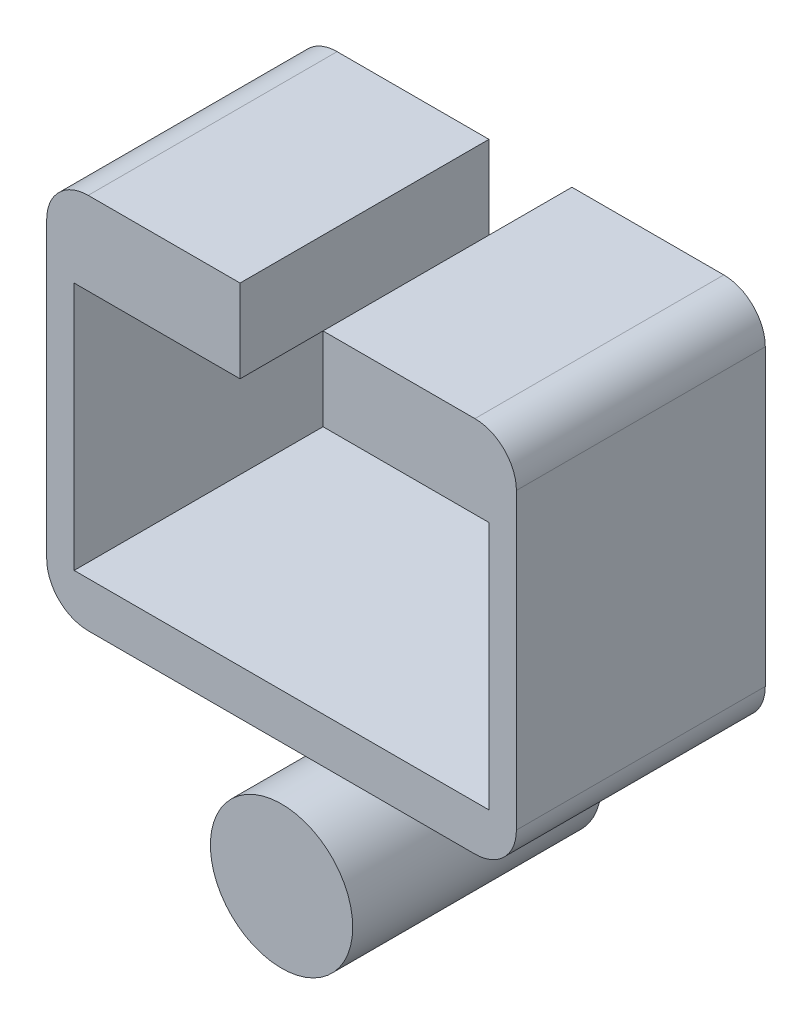
ISO-10303-21;
HEADER;
FILE_DESCRIPTION(('STEP AP214'),'2;1');
FILE_NAME('part.step','',(''),(''),'','','');
FILE_SCHEMA(('AUTOMOTIVE_DESIGN { 1 0 10303 214 1 1 1 1 }'));
ENDSEC;
DATA;
#1=APPLICATION_CONTEXT('core data for automotive mechanical design processes');
#2=APPLICATION_PROTOCOL_DEFINITION('international standard','automotive_design',2000,#1);
#3=PRODUCT_CONTEXT('',#1,'mechanical');
#4=PRODUCT('Part','Part','',(#3));
#5=PRODUCT_RELATED_PRODUCT_CATEGORY('part','',(#4));
#6=PRODUCT_DEFINITION_FORMATION('','',#4);
#7=PRODUCT_DEFINITION_CONTEXT('part definition',#1,'design');
#8=PRODUCT_DEFINITION('design','',#6,#7);
#9=PRODUCT_DEFINITION_SHAPE('','',#8);
#10=(LENGTH_UNIT() NAMED_UNIT(*) SI_UNIT(.MILLI.,.METRE.));
#11=(NAMED_UNIT(*) PLANE_ANGLE_UNIT() SI_UNIT($,.RADIAN.));
#12=(NAMED_UNIT(*) SI_UNIT($,.STERADIAN.) SOLID_ANGLE_UNIT());
#13=UNCERTAINTY_MEASURE_WITH_UNIT(LENGTH_MEASURE(1.E-05),#10,'distance_accuracy_value','');
#14=(GEOMETRIC_REPRESENTATION_CONTEXT(3) GLOBAL_UNCERTAINTY_ASSIGNED_CONTEXT((#13)) GLOBAL_UNIT_ASSIGNED_CONTEXT((#10,
#11,#12)) REPRESENTATION_CONTEXT('',''));
#15=CARTESIAN_POINT('',(0.,0.,0.));
#16=DIRECTION('',(0.,0.,1.));
#17=DIRECTION('',(1.,0.,0.));
#18=AXIS2_PLACEMENT_3D('',#15,#16,#17);
#19=CARTESIAN_POINT('',(0.,0.,-38.1));
#20=DIRECTION('',(0.,0.,1.));
#21=DIRECTION('',(1.,0.,0.));
#22=AXIS2_PLACEMENT_3D('',#19,#20,#21);
#23=CYLINDRICAL_SURFACE('',#22,10.8950456396128);
#24=DIRECTION('',(0.,0.,1.));
#25=VECTOR('',#24,1.);
#26=CARTESIAN_POINT('',(10.8950456396128,0.,-38.1));
#27=LINE('',#26,#25);
#28=CARTESIAN_POINT('',(10.8950456396128,0.,-29.21));
#29=VERTEX_POINT('',#28);
#30=CARTESIAN_POINT('',(10.8950456396128,0.,-38.1));
#31=VERTEX_POINT('',#30);
#32=EDGE_CURVE('E340',#29,#31,#27,.F.);
#33=ORIENTED_EDGE('',*,*,#32,.F.);
#34=CARTESIAN_POINT('',(0.,0.,-29.21));
#35=DIRECTION('',(0.,0.,-1.));
#36=DIRECTION('',(-1.,0.,0.));
#37=AXIS2_PLACEMENT_3D('',#34,#35,#36);
#38=CIRCLE('',#37,10.8950456396128);
#39=CARTESIAN_POINT('',(-10.8950456396128,0.,-29.21));
#40=VERTEX_POINT('',#39);
#41=EDGE_CURVE('E329',#29,#40,#38,.F.);
#42=ORIENTED_EDGE('',*,*,#41,.T.);
#43=DIRECTION('',(0.,0.,1.));
#44=VECTOR('',#43,1.);
#45=CARTESIAN_POINT('',(-10.8950456396128,0.,-38.1));
#46=LINE('',#45,#44);
#47=CARTESIAN_POINT('',(-10.8950456396128,0.,-38.1));
#48=VERTEX_POINT('',#47);
#49=EDGE_CURVE('E332',#48,#40,#46,.T.);
#50=ORIENTED_EDGE('',*,*,#49,.F.);
#51=CARTESIAN_POINT('',(0.,0.,-38.1));
#52=DIRECTION('',(0.,0.,1.));
#53=DIRECTION('',(1.,0.,0.));
#54=AXIS2_PLACEMENT_3D('',#51,#52,#53);
#55=CIRCLE('',#54,10.8950456396128);
#56=EDGE_CURVE('E328',#48,#31,#55,.T.);
#57=ORIENTED_EDGE('',*,*,#56,.T.);
#58=EDGE_LOOP('',(#33,#42,#50,#57));
#59=FACE_BOUND('',#58,.T.);
#60=CARTESIAN_POINT('',(0.,0.,0.));
#61=DIRECTION('',(0.,0.,1.));
#62=DIRECTION('',(1.,0.,0.));
#63=AXIS2_PLACEMENT_3D('',#60,#61,#62);
#64=CIRCLE('',#63,10.8950456396128);
#65=CARTESIAN_POINT('',(10.8950456396128,0.,0.));
#66=VERTEX_POINT('',#65);
#67=EDGE_CURVE('E319',#66,#66,#64,.T.);
#68=ORIENTED_EDGE('',*,*,#67,.F.);
#69=EDGE_LOOP('',(#68));
#70=FACE_BOUND('',#69,.T.);
#71=ADVANCED_FACE('F44',(#59,#70),#23,.T.);
#72=CARTESIAN_POINT('',(0.,0.,-38.1));
#73=DIRECTION('',(0.,0.,1.));
#74=DIRECTION('',(1.,0.,0.));
#75=AXIS2_PLACEMENT_3D('',#72,#73,#74);
#76=PLANE('',#75);
#77=DIRECTION('',(0.,-1.,0.));
#78=VECTOR('',#77,1.);
#79=CARTESIAN_POINT('',(35.948347107438,19.05,-38.1));
#80=LINE('',#79,#78);
#81=CARTESIAN_POINT('',(35.948347107438,70.4272727272727,-38.1));
#82=VERTEX_POINT('',#81);
#83=CARTESIAN_POINT('',(35.948347107438,25.4,-38.1));
#84=VERTEX_POINT('',#83);
#85=EDGE_CURVE('E210',#82,#84,#80,.T.);
#86=ORIENTED_EDGE('',*,*,#85,.T.);
#87=CARTESIAN_POINT('',(29.598347107438,25.4,-38.1));
#88=DIRECTION('',(0.,0.,1.));
#89=DIRECTION('',(1.,0.,0.));
#90=AXIS2_PLACEMENT_3D('',#87,#88,#89);
#91=CIRCLE('',#90,6.35);
#92=CARTESIAN_POINT('',(29.598347107438,19.05,-38.1));
#93=VERTEX_POINT('',#92);
#94=EDGE_CURVE('E347',#84,#93,#91,.F.);
#95=ORIENTED_EDGE('',*,*,#94,.T.);
#96=DIRECTION('',(-1.,0.,0.));
#97=VECTOR('',#96,1.);
#98=CARTESIAN_POINT('',(31.75,19.05,-38.1));
#99=LINE('',#98,#97);
#100=CARTESIAN_POINT('',(22.6043964939591,19.05,-38.1));
#101=VERTEX_POINT('',#100);
#102=EDGE_CURVE('E283',#93,#101,#99,.T.);
#103=ORIENTED_EDGE('',*,*,#102,.T.);
#104=DIRECTION('',(-0.514442680250786,-0.857524768584784,0.));
#105=VECTOR('',#104,1.);
#106=CARTESIAN_POINT('',(22.6043964939591,19.05,-38.1));
#107=LINE('',#106,#105);
#108=CARTESIAN_POINT('',(11.176,0.,-38.1));
#109=VERTEX_POINT('',#108);
#110=EDGE_CURVE('E289',#101,#109,#107,.T.);
#111=ORIENTED_EDGE('',*,*,#110,.T.);
#112=DIRECTION('',(-1.,0.,0.));
#113=VECTOR('',#112,1.);
#114=CARTESIAN_POINT('',(11.176,0.,-38.1));
#115=LINE('',#114,#113);
#116=EDGE_CURVE('E311',#109,#31,#115,.T.);
#117=ORIENTED_EDGE('',*,*,#116,.T.);
#118=ORIENTED_EDGE('',*,*,#56,.F.);
#119=CARTESIAN_POINT('',(-11.176,0.,-38.1));
#120=VERTEX_POINT('',#119);
#121=EDGE_CURVE('E309',#48,#120,#115,.T.);
#122=ORIENTED_EDGE('',*,*,#121,.T.);
#123=DIRECTION('',(-0.514442680250785,0.857524768584784,0.));
#124=VECTOR('',#123,1.);
#125=CARTESIAN_POINT('',(-22.6043964939591,19.05,-38.1));
#126=LINE('',#125,#124);
#127=CARTESIAN_POINT('',(-22.6043964939591,19.05,-38.1));
#128=VERTEX_POINT('',#127);
#129=EDGE_CURVE('E300',#120,#128,#126,.T.);
#130=ORIENTED_EDGE('',*,*,#129,.T.);
#131=CARTESIAN_POINT('',(-29.598347107438,19.05,-38.1));
#132=VERTEX_POINT('',#131);
#133=EDGE_CURVE('E290',#128,#132,#99,.T.);
#134=ORIENTED_EDGE('',*,*,#133,.T.);
#135=CARTESIAN_POINT('',(-29.598347107438,25.4,-38.1));
#136=DIRECTION('',(0.,0.,1.));
#137=DIRECTION('',(1.,0.,0.));
#138=AXIS2_PLACEMENT_3D('',#135,#136,#137);
#139=CIRCLE('',#138,6.35);
#140=CARTESIAN_POINT('',(-35.948347107438,25.4,-38.1));
#141=VERTEX_POINT('',#140);
#142=EDGE_CURVE('E348',#132,#141,#139,.F.);
#143=ORIENTED_EDGE('',*,*,#142,.T.);
#144=DIRECTION('',(0.,1.,0.));
#145=VECTOR('',#144,1.);
#146=CARTESIAN_POINT('',(-35.948347107438,76.7772727272727,-38.1));
#147=LINE('',#146,#145);
#148=CARTESIAN_POINT('',(-35.948347107438,70.4272727272727,-38.1));
#149=VERTEX_POINT('',#148);
#150=EDGE_CURVE('E233',#141,#149,#147,.T.);
#151=ORIENTED_EDGE('',*,*,#150,.T.);
#152=CARTESIAN_POINT('',(-29.598347107438,70.4272727272727,-38.1));
#153=DIRECTION('',(0.,0.,1.));
#154=DIRECTION('',(1.,0.,0.));
#155=AXIS2_PLACEMENT_3D('',#152,#153,#154);
#156=CIRCLE('',#155,6.35);
#157=CARTESIAN_POINT('',(-29.598347107438,76.7772727272727,-38.1));
#158=VERTEX_POINT('',#157);
#159=EDGE_CURVE('E343',#149,#158,#156,.F.);
#160=ORIENTED_EDGE('',*,*,#159,.T.);
#161=DIRECTION('',(1.,0.,0.));
#162=VECTOR('',#161,1.);
#163=CARTESIAN_POINT('',(-6.35,76.7772727272727,-38.1));
#164=LINE('',#163,#162);
#165=CARTESIAN_POINT('',(-6.35,76.7772727272727,-38.1));
#166=VERTEX_POINT('',#165);
#167=EDGE_CURVE('E261',#158,#166,#164,.T.);
#168=ORIENTED_EDGE('',*,*,#167,.T.);
#169=DIRECTION('',(0.,-1.,0.));
#170=VECTOR('',#169,1.);
#171=CARTESIAN_POINT('',(-6.35,64.0772727272727,-38.1));
#172=LINE('',#171,#170);
#173=CARTESIAN_POINT('',(-6.35,64.0772727272727,-38.1));
#174=VERTEX_POINT('',#173);
#175=EDGE_CURVE('E257',#166,#174,#172,.T.);
#176=ORIENTED_EDGE('',*,*,#175,.T.);
#177=DIRECTION('',(-1.,0.,0.));
#178=VECTOR('',#177,1.);
#179=CARTESIAN_POINT('',(-31.75,64.0772727272727,-38.1));
#180=LINE('',#179,#178);
#181=CARTESIAN_POINT('',(-31.75,64.0772727272727,-38.1));
#182=VERTEX_POINT('',#181);
#183=EDGE_CURVE('E259',#174,#182,#180,.T.);
#184=ORIENTED_EDGE('',*,*,#183,.T.);
#185=DIRECTION('',(0.,-1.,0.));
#186=VECTOR('',#185,1.);
#187=CARTESIAN_POINT('',(-31.75,25.9772727272727,-38.1));
#188=LINE('',#187,#186);
#189=CARTESIAN_POINT('',(-31.75,25.9772727272727,-38.1));
#190=VERTEX_POINT('',#189);
#191=EDGE_CURVE('E254',#182,#190,#188,.T.);
#192=ORIENTED_EDGE('',*,*,#191,.T.);
#193=DIRECTION('',(1.,0.,0.));
#194=VECTOR('',#193,1.);
#195=CARTESIAN_POINT('',(31.75,25.9772727272727,-38.1));
#196=LINE('',#195,#194);
#197=CARTESIAN_POINT('',(31.75,25.9772727272727,-38.1));
#198=VERTEX_POINT('',#197);
#199=EDGE_CURVE('E243',#190,#198,#196,.T.);
#200=ORIENTED_EDGE('',*,*,#199,.T.);
#201=DIRECTION('',(0.,1.,0.));
#202=VECTOR('',#201,1.);
#203=CARTESIAN_POINT('',(31.75,25.9772727272727,-38.1));
#204=LINE('',#203,#202);
#205=CARTESIAN_POINT('',(31.75,64.0772727272727,-38.1));
#206=VERTEX_POINT('',#205);
#207=EDGE_CURVE('E230',#198,#206,#204,.T.);
#208=ORIENTED_EDGE('',*,*,#207,.T.);
#209=DIRECTION('',(-1.,0.,0.));
#210=VECTOR('',#209,1.);
#211=CARTESIAN_POINT('',(31.75,64.0772727272727,-38.1));
#212=LINE('',#211,#210);
#213=CARTESIAN_POINT('',(6.35,64.0772727272727,-38.1));
#214=VERTEX_POINT('',#213);
#215=EDGE_CURVE('E215',#206,#214,#212,.T.);
#216=ORIENTED_EDGE('',*,*,#215,.T.);
#217=DIRECTION('',(0.,1.,0.));
#218=VECTOR('',#217,1.);
#219=CARTESIAN_POINT('',(6.35,64.0772727272727,-38.1));
#220=LINE('',#219,#218);
#221=CARTESIAN_POINT('',(6.35,76.7772727272727,-38.1));
#222=VERTEX_POINT('',#221);
#223=EDGE_CURVE('E231',#214,#222,#220,.T.);
#224=ORIENTED_EDGE('',*,*,#223,.T.);
#225=DIRECTION('',(1.,0.,0.));
#226=VECTOR('',#225,1.);
#227=CARTESIAN_POINT('',(6.35,76.7772727272727,-38.1));
#228=LINE('',#227,#226);
#229=CARTESIAN_POINT('',(29.598347107438,76.7772727272727,-38.1));
#230=VERTEX_POINT('',#229);
#231=EDGE_CURVE('E236',#222,#230,#228,.T.);
#232=ORIENTED_EDGE('',*,*,#231,.T.);
#233=CARTESIAN_POINT('',(29.598347107438,70.4272727272727,-38.1));
#234=DIRECTION('',(0.,0.,1.));
#235=DIRECTION('',(1.,0.,0.));
#236=AXIS2_PLACEMENT_3D('',#233,#234,#235);
#237=CIRCLE('',#236,6.35);
#238=EDGE_CURVE('E346',#230,#82,#237,.F.);
#239=ORIENTED_EDGE('',*,*,#238,.T.);
#240=EDGE_LOOP('',(#86,#95,#103,#111,#117,#118,#122,#130,#134,#143,#151,#160,#168,#176,#184,
#192,#200,#208,#216,#224,#232,#239));
#241=FACE_BOUND('',#240,.T.);
#242=ADVANCED_FACE('F381',(#241),#76,.F.);
#243=CARTESIAN_POINT('',(0.,0.,0.));
#244=DIRECTION('',(0.,0.,1.));
#245=DIRECTION('',(1.,0.,0.));
#246=AXIS2_PLACEMENT_3D('',#243,#244,#245);
#247=PLANE('',#246);
#248=ORIENTED_EDGE('',*,*,#67,.T.);
#249=EDGE_LOOP('',(#248));
#250=FACE_BOUND('',#249,.T.);
#251=ADVANCED_FACE('F427',(#250),#247,.T.);
#252=CARTESIAN_POINT('',(11.176,0.,-29.21));
#253=DIRECTION('',(0.,-1.,0.));
#254=DIRECTION('',(1.,0.,0.));
#255=AXIS2_PLACEMENT_3D('',#252,#253,#254);
#256=PLANE('',#255);
#257=DIRECTION('',(-1.,0.,0.));
#258=VECTOR('',#257,1.);
#259=CARTESIAN_POINT('',(11.176,0.,-29.21));
#260=LINE('',#259,#258);
#261=CARTESIAN_POINT('',(11.176,0.,-29.21));
#262=VERTEX_POINT('',#261);
#263=EDGE_CURVE('E301',#262,#29,#260,.T.);
#264=ORIENTED_EDGE('',*,*,#263,.T.);
#265=ORIENTED_EDGE('',*,*,#32,.T.);
#266=ORIENTED_EDGE('',*,*,#116,.F.);
#267=DIRECTION('',(0.,0.,-1.));
#268=VECTOR('',#267,1.);
#269=CARTESIAN_POINT('',(11.176,0.,-29.21));
#270=LINE('',#269,#268);
#271=EDGE_CURVE('E321',#262,#109,#270,.T.);
#272=ORIENTED_EDGE('',*,*,#271,.F.);
#273=EDGE_LOOP('',(#264,#265,#266,#272));
#274=FACE_BOUND('',#273,.T.);
#275=ADVANCED_FACE('F482',(#274),#256,.T.);
#276=CARTESIAN_POINT('',(-22.6043964939591,19.05,-29.21));
#277=DIRECTION('',(-0.857524768584784,-0.514442680250785,0.));
#278=DIRECTION('',(0.514442680250785,-0.857524768584784,0.));
#279=AXIS2_PLACEMENT_3D('',#276,#277,#278);
#280=PLANE('',#279);
#281=ORIENTED_EDGE('',*,*,#129,.F.);
#282=DIRECTION('',(0.,0.,-1.));
#283=VECTOR('',#282,1.);
#284=CARTESIAN_POINT('',(-11.176,0.,-29.21));
#285=LINE('',#284,#283);
#286=CARTESIAN_POINT('',(-11.176,0.,-29.21));
#287=VERTEX_POINT('',#286);
#288=EDGE_CURVE('E316',#287,#120,#285,.T.);
#289=ORIENTED_EDGE('',*,*,#288,.F.);
#290=DIRECTION('',(-0.514442680250785,0.857524768584784,0.));
#291=VECTOR('',#290,1.);
#292=CARTESIAN_POINT('',(-22.6043964939591,19.05,-29.21));
#293=LINE('',#292,#291);
#294=CARTESIAN_POINT('',(-22.6043964939591,19.05,-29.21));
#295=VERTEX_POINT('',#294);
#296=EDGE_CURVE('E302',#287,#295,#293,.T.);
#297=ORIENTED_EDGE('',*,*,#296,.T.);
#298=DIRECTION('',(0.,0.,-1.));
#299=VECTOR('',#298,1.);
#300=CARTESIAN_POINT('',(-22.6043964939591,19.05,-29.21));
#301=LINE('',#300,#299);
#302=EDGE_CURVE('E317',#295,#128,#301,.T.);
#303=ORIENTED_EDGE('',*,*,#302,.T.);
#304=EDGE_LOOP('',(#281,#289,#297,#303));
#305=FACE_BOUND('',#304,.T.);
#306=ADVANCED_FACE('F388',(#305),#280,.T.);
#307=ORIENTED_EDGE('',*,*,#121,.F.);
#308=ORIENTED_EDGE('',*,*,#49,.T.);
#309=EDGE_CURVE('E297',#40,#287,#260,.T.);
#310=ORIENTED_EDGE('',*,*,#309,.T.);
#311=ORIENTED_EDGE('',*,*,#288,.T.);
#312=EDGE_LOOP('',(#307,#308,#310,#311));
#313=FACE_BOUND('',#312,.T.);
#314=ADVANCED_FACE('F483',(#313),#256,.T.);
#315=CARTESIAN_POINT('',(22.6043964939591,19.05,-29.21));
#316=DIRECTION('',(0.857524768584784,-0.514442680250786,0.));
#317=DIRECTION('',(0.514442680250786,0.857524768584784,0.));
#318=AXIS2_PLACEMENT_3D('',#315,#316,#317);
#319=PLANE('',#318);
#320=ORIENTED_EDGE('',*,*,#110,.F.);
#321=DIRECTION('',(0.,0.,-1.));
#322=VECTOR('',#321,1.);
#323=CARTESIAN_POINT('',(22.6043964939591,19.05,-29.21));
#324=LINE('',#323,#322);
#325=CARTESIAN_POINT('',(22.6043964939591,19.05,-29.21));
#326=VERTEX_POINT('',#325);
#327=EDGE_CURVE('E310',#326,#101,#324,.T.);
#328=ORIENTED_EDGE('',*,*,#327,.F.);
#329=DIRECTION('',(-0.514442680250786,-0.857524768584784,0.));
#330=VECTOR('',#329,1.);
#331=CARTESIAN_POINT('',(22.6043964939591,19.05,-29.21));
#332=LINE('',#331,#330);
#333=EDGE_CURVE('E298',#326,#262,#332,.T.);
#334=ORIENTED_EDGE('',*,*,#333,.T.);
#335=ORIENTED_EDGE('',*,*,#271,.T.);
#336=EDGE_LOOP('',(#320,#328,#334,#335));
#337=FACE_BOUND('',#336,.T.);
#338=ADVANCED_FACE('F400',(#337),#319,.T.);
#339=CARTESIAN_POINT('',(0.,0.,-29.21));
#340=DIRECTION('',(0.,0.,-1.));
#341=DIRECTION('',(-1.,0.,0.));
#342=AXIS2_PLACEMENT_3D('',#339,#340,#341);
#343=PLANE('',#342);
#344=ORIENTED_EDGE('',*,*,#41,.F.);
#345=ORIENTED_EDGE('',*,*,#263,.F.);
#346=ORIENTED_EDGE('',*,*,#333,.F.);
#347=DIRECTION('',(1.,0.,0.));
#348=VECTOR('',#347,1.);
#349=CARTESIAN_POINT('',(11.176,19.05,-29.21));
#350=LINE('',#349,#348);
#351=EDGE_CURVE('E291',#295,#326,#350,.T.);
#352=ORIENTED_EDGE('',*,*,#351,.F.);
#353=ORIENTED_EDGE('',*,*,#296,.F.);
#354=ORIENTED_EDGE('',*,*,#309,.F.);
#355=EDGE_LOOP('',(#344,#345,#346,#352,#353,#354));
#356=FACE_BOUND('',#355,.T.);
#357=ADVANCED_FACE('F391',(#356),#343,.F.);
#358=CARTESIAN_POINT('',(31.75,19.05,0.));
#359=DIRECTION('',(0.,-1.,0.));
#360=DIRECTION('',(0.,0.,-1.));
#361=AXIS2_PLACEMENT_3D('',#358,#359,#360);
#362=PLANE('',#361);
#363=ORIENTED_EDGE('',*,*,#102,.F.);
#364=DIRECTION('',(0.,0.,-1.));
#365=VECTOR('',#364,1.);
#366=CARTESIAN_POINT('',(29.598347107438,19.05,0.));
#367=LINE('',#366,#365);
#368=CARTESIAN_POINT('',(29.598347107438,19.05,0.));
#369=VERTEX_POINT('',#368);
#370=EDGE_CURVE('E354',#93,#369,#367,.F.);
#371=ORIENTED_EDGE('',*,*,#370,.T.);
#372=DIRECTION('',(-1.,0.,0.));
#373=VECTOR('',#372,1.);
#374=CARTESIAN_POINT('',(31.75,19.05,0.));
#375=LINE('',#374,#373);
#376=CARTESIAN_POINT('',(-29.598347107438,19.05,0.));
#377=VERTEX_POINT('',#376);
#378=EDGE_CURVE('E277',#369,#377,#375,.T.);
#379=ORIENTED_EDGE('',*,*,#378,.T.);
#380=DIRECTION('',(0.,0.,-1.));
#381=VECTOR('',#380,1.);
#382=CARTESIAN_POINT('',(-29.598347107438,19.05,0.));
#383=LINE('',#382,#381);
#384=EDGE_CURVE('E355',#377,#132,#383,.T.);
#385=ORIENTED_EDGE('',*,*,#384,.T.);
#386=ORIENTED_EDGE('',*,*,#133,.F.);
#387=ORIENTED_EDGE('',*,*,#302,.F.);
#388=ORIENTED_EDGE('',*,*,#351,.T.);
#389=ORIENTED_EDGE('',*,*,#327,.T.);
#390=EDGE_LOOP('',(#363,#371,#379,#385,#386,#387,#388,#389));
#391=FACE_BOUND('',#390,.T.);
#392=ADVANCED_FACE('F382',(#391),#362,.T.);
#393=CARTESIAN_POINT('',(31.75,25.9772727272727,0.));
#394=DIRECTION('',(0.,1.,0.));
#395=DIRECTION('',(0.,0.,1.));
#396=AXIS2_PLACEMENT_3D('',#393,#394,#395);
#397=PLANE('',#396);
#398=ORIENTED_EDGE('',*,*,#199,.F.);
#399=DIRECTION('',(0.,0.,-1.));
#400=VECTOR('',#399,1.);
#401=CARTESIAN_POINT('',(-31.75,25.9772727272727,0.));
#402=LINE('',#401,#400);
#403=CARTESIAN_POINT('',(-31.75,25.9772727272727,0.));
#404=VERTEX_POINT('',#403);
#405=EDGE_CURVE('E284',#404,#190,#402,.T.);
#406=ORIENTED_EDGE('',*,*,#405,.F.);
#407=DIRECTION('',(1.,0.,0.));
#408=VECTOR('',#407,1.);
#409=CARTESIAN_POINT('',(31.75,25.9772727272727,0.));
#410=LINE('',#409,#408);
#411=CARTESIAN_POINT('',(31.75,25.9772727272727,0.));
#412=VERTEX_POINT('',#411);
#413=EDGE_CURVE('E280',#404,#412,#410,.T.);
#414=ORIENTED_EDGE('',*,*,#413,.T.);
#415=DIRECTION('',(0.,0.,-1.));
#416=VECTOR('',#415,1.);
#417=CARTESIAN_POINT('',(31.75,25.9772727272727,0.));
#418=LINE('',#417,#416);
#419=EDGE_CURVE('E205',#412,#198,#418,.T.);
#420=ORIENTED_EDGE('',*,*,#419,.T.);
#421=EDGE_LOOP('',(#398,#406,#414,#420));
#422=FACE_BOUND('',#421,.T.);
#423=ADVANCED_FACE('F461',(#422),#397,.T.);
#424=CARTESIAN_POINT('',(0.,0.,0.));
#425=DIRECTION('',(0.,0.,1.));
#426=DIRECTION('',(1.,0.,0.));
#427=AXIS2_PLACEMENT_3D('',#424,#425,#426);
#428=PLANE('',#427);
#429=ORIENTED_EDGE('',*,*,#378,.F.);
#430=CARTESIAN_POINT('',(29.598347107438,25.4,0.));
#431=DIRECTION('',(0.,0.,1.));
#432=DIRECTION('',(1.,0.,0.));
#433=AXIS2_PLACEMENT_3D('',#430,#431,#432);
#434=CIRCLE('',#433,6.35);
#435=CARTESIAN_POINT('',(35.948347107438,25.4,0.));
#436=VERTEX_POINT('',#435);
#437=EDGE_CURVE('E363',#369,#436,#434,.T.);
#438=ORIENTED_EDGE('',*,*,#437,.T.);
#439=DIRECTION('',(0.,-1.,0.));
#440=VECTOR('',#439,1.);
#441=CARTESIAN_POINT('',(35.948347107438,19.05,0.));
#442=LINE('',#441,#440);
#443=CARTESIAN_POINT('',(35.948347107438,70.4272727272727,0.));
#444=VERTEX_POINT('',#443);
#445=EDGE_CURVE('E212',#444,#436,#442,.T.);
#446=ORIENTED_EDGE('',*,*,#445,.F.);
#447=CARTESIAN_POINT('',(29.598347107438,70.4272727272727,0.));
#448=DIRECTION('',(0.,0.,1.));
#449=DIRECTION('',(1.,0.,0.));
#450=AXIS2_PLACEMENT_3D('',#447,#448,#449);
#451=CIRCLE('',#450,6.35);
#452=CARTESIAN_POINT('',(29.598347107438,76.7772727272727,0.));
#453=VERTEX_POINT('',#452);
#454=EDGE_CURVE('E58',#444,#453,#451,.T.);
#455=ORIENTED_EDGE('',*,*,#454,.T.);
#456=DIRECTION('',(1.,0.,0.));
#457=VECTOR('',#456,1.);
#458=CARTESIAN_POINT('',(6.35,76.7772727272727,0.));
#459=LINE('',#458,#457);
#460=CARTESIAN_POINT('',(6.35,76.7772727272727,0.));
#461=VERTEX_POINT('',#460);
#462=EDGE_CURVE('E223',#461,#453,#459,.T.);
#463=ORIENTED_EDGE('',*,*,#462,.F.);
#464=DIRECTION('',(0.,1.,0.));
#465=VECTOR('',#464,1.);
#466=CARTESIAN_POINT('',(6.35,64.0772727272727,0.));
#467=LINE('',#466,#465);
#468=CARTESIAN_POINT('',(6.35,64.0772727272727,0.));
#469=VERTEX_POINT('',#468);
#470=EDGE_CURVE('E221',#469,#461,#467,.T.);
#471=ORIENTED_EDGE('',*,*,#470,.F.);
#472=DIRECTION('',(-1.,0.,0.));
#473=VECTOR('',#472,1.);
#474=CARTESIAN_POINT('',(31.75,64.0772727272727,0.));
#475=LINE('',#474,#473);
#476=CARTESIAN_POINT('',(31.75,64.0772727272727,0.));
#477=VERTEX_POINT('',#476);
#478=EDGE_CURVE('E207',#477,#469,#475,.T.);
#479=ORIENTED_EDGE('',*,*,#478,.F.);
#480=DIRECTION('',(0.,1.,0.));
#481=VECTOR('',#480,1.);
#482=CARTESIAN_POINT('',(31.75,19.05,0.));
#483=LINE('',#482,#481);
#484=EDGE_CURVE('E198',#412,#477,#483,.T.);
#485=ORIENTED_EDGE('',*,*,#484,.F.);
#486=ORIENTED_EDGE('',*,*,#413,.F.);
#487=DIRECTION('',(0.,-1.,0.));
#488=VECTOR('',#487,1.);
#489=CARTESIAN_POINT('',(-31.75,19.05,0.));
#490=LINE('',#489,#488);
#491=CARTESIAN_POINT('',(-31.75,64.0772727272727,0.));
#492=VERTEX_POINT('',#491);
#493=EDGE_CURVE('E256',#492,#404,#490,.T.);
#494=ORIENTED_EDGE('',*,*,#493,.F.);
#495=DIRECTION('',(-1.,0.,0.));
#496=VECTOR('',#495,1.);
#497=CARTESIAN_POINT('',(-31.75,64.0772727272727,0.));
#498=LINE('',#497,#496);
#499=CARTESIAN_POINT('',(-6.35,64.0772727272727,0.));
#500=VERTEX_POINT('',#499);
#501=EDGE_CURVE('E247',#500,#492,#498,.T.);
#502=ORIENTED_EDGE('',*,*,#501,.F.);
#503=DIRECTION('',(0.,-1.,0.));
#504=VECTOR('',#503,1.);
#505=CARTESIAN_POINT('',(-6.35,64.0772727272727,0.));
#506=LINE('',#505,#504);
#507=CARTESIAN_POINT('',(-6.35,76.7772727272727,0.));
#508=VERTEX_POINT('',#507);
#509=EDGE_CURVE('E267',#508,#500,#506,.T.);
#510=ORIENTED_EDGE('',*,*,#509,.F.);
#511=DIRECTION('',(1.,0.,0.));
#512=VECTOR('',#511,1.);
#513=CARTESIAN_POINT('',(-6.35,76.7772727272727,0.));
#514=LINE('',#513,#512);
#515=CARTESIAN_POINT('',(-29.598347107438,76.7772727272727,0.));
#516=VERTEX_POINT('',#515);
#517=EDGE_CURVE('E275',#516,#508,#514,.T.);
#518=ORIENTED_EDGE('',*,*,#517,.F.);
#519=CARTESIAN_POINT('',(-29.598347107438,70.4272727272727,0.));
#520=DIRECTION('',(0.,0.,1.));
#521=DIRECTION('',(1.,0.,0.));
#522=AXIS2_PLACEMENT_3D('',#519,#520,#521);
#523=CIRCLE('',#522,6.35);
#524=CARTESIAN_POINT('',(-35.948347107438,70.4272727272727,0.));
#525=VERTEX_POINT('',#524);
#526=EDGE_CURVE('E70',#516,#525,#523,.T.);
#527=ORIENTED_EDGE('',*,*,#526,.T.);
#528=DIRECTION('',(0.,1.,0.));
#529=VECTOR('',#528,1.);
#530=CARTESIAN_POINT('',(-35.948347107438,76.7772727272727,0.));
#531=LINE('',#530,#529);
#532=CARTESIAN_POINT('',(-35.948347107438,25.4,0.));
#533=VERTEX_POINT('',#532);
#534=EDGE_CURVE('E274',#533,#525,#531,.T.);
#535=ORIENTED_EDGE('',*,*,#534,.F.);
#536=CARTESIAN_POINT('',(-29.598347107438,25.4,0.));
#537=DIRECTION('',(0.,0.,1.));
#538=DIRECTION('',(1.,0.,0.));
#539=AXIS2_PLACEMENT_3D('',#536,#537,#538);
#540=CIRCLE('',#539,6.35);
#541=EDGE_CURVE('E356',#533,#377,#540,.T.);
#542=ORIENTED_EDGE('',*,*,#541,.T.);
#543=EDGE_LOOP('',(#429,#438,#446,#455,#463,#471,#479,#485,#486,#494,#502,#510,#518,#527,#535,#542));
#544=FACE_BOUND('',#543,.T.);
#545=ADVANCED_FACE('F219',(#544),#428,.T.);
#546=CARTESIAN_POINT('',(31.75,25.9772727272727,0.));
#547=DIRECTION('',(-1.,0.,0.));
#548=DIRECTION('',(0.,0.,1.));
#549=AXIS2_PLACEMENT_3D('',#546,#547,#548);
#550=PLANE('',#549);
#551=ORIENTED_EDGE('',*,*,#419,.F.);
#552=ORIENTED_EDGE('',*,*,#484,.T.);
#553=DIRECTION('',(0.,0.,-1.));
#554=VECTOR('',#553,1.);
#555=CARTESIAN_POINT('',(31.75,64.0772727272727,0.));
#556=LINE('',#555,#554);
#557=EDGE_CURVE('E199',#477,#206,#556,.T.);
#558=ORIENTED_EDGE('',*,*,#557,.T.);
#559=ORIENTED_EDGE('',*,*,#207,.F.);
#560=EDGE_LOOP('',(#551,#552,#558,#559));
#561=FACE_BOUND('',#560,.T.);
#562=ADVANCED_FACE('F196',(#561),#550,.T.);
#563=CARTESIAN_POINT('',(35.948347107438,19.05,0.));
#564=DIRECTION('',(1.,0.,0.));
#565=DIRECTION('',(0.,0.,-1.));
#566=AXIS2_PLACEMENT_3D('',#563,#564,#565);
#567=PLANE('',#566);
#568=ORIENTED_EDGE('',*,*,#445,.T.);
#569=DIRECTION('',(0.,0.,-1.));
#570=VECTOR('',#569,1.);
#571=CARTESIAN_POINT('',(35.948347107438,25.4,0.));
#572=LINE('',#571,#570);
#573=EDGE_CURVE('E344',#436,#84,#572,.T.);
#574=ORIENTED_EDGE('',*,*,#573,.T.);
#575=ORIENTED_EDGE('',*,*,#85,.F.);
#576=DIRECTION('',(0.,0.,-1.));
#577=VECTOR('',#576,1.);
#578=CARTESIAN_POINT('',(35.948347107438,70.4272727272727,0.));
#579=LINE('',#578,#577);
#580=EDGE_CURVE('E339',#82,#444,#579,.F.);
#581=ORIENTED_EDGE('',*,*,#580,.T.);
#582=EDGE_LOOP('',(#568,#574,#575,#581));
#583=FACE_BOUND('',#582,.T.);
#584=ADVANCED_FACE('F403',(#583),#567,.T.);
#585=CARTESIAN_POINT('',(6.35,76.7772727272727,0.));
#586=DIRECTION('',(0.,1.,0.));
#587=DIRECTION('',(0.,0.,1.));
#588=AXIS2_PLACEMENT_3D('',#585,#586,#587);
#589=PLANE('',#588);
#590=ORIENTED_EDGE('',*,*,#462,.T.);
#591=DIRECTION('',(0.,0.,-1.));
#592=VECTOR('',#591,1.);
#593=CARTESIAN_POINT('',(29.598347107438,76.7772727272727,0.));
#594=LINE('',#593,#592);
#595=EDGE_CURVE('E361',#453,#230,#594,.T.);
#596=ORIENTED_EDGE('',*,*,#595,.T.);
#597=ORIENTED_EDGE('',*,*,#231,.F.);
#598=DIRECTION('',(0.,0.,-1.));
#599=VECTOR('',#598,1.);
#600=CARTESIAN_POINT('',(6.35,76.7772727272727,0.));
#601=LINE('',#600,#599);
#602=EDGE_CURVE('E241',#461,#222,#601,.T.);
#603=ORIENTED_EDGE('',*,*,#602,.F.);
#604=EDGE_LOOP('',(#590,#596,#597,#603));
#605=FACE_BOUND('',#604,.T.);
#606=ADVANCED_FACE('F411',(#605),#589,.T.);
#607=CARTESIAN_POINT('',(6.35,64.0772727272727,0.));
#608=DIRECTION('',(-1.,0.,0.));
#609=DIRECTION('',(0.,0.,1.));
#610=AXIS2_PLACEMENT_3D('',#607,#608,#609);
#611=PLANE('',#610);
#612=ORIENTED_EDGE('',*,*,#223,.F.);
#613=DIRECTION('',(0.,0.,-1.));
#614=VECTOR('',#613,1.);
#615=CARTESIAN_POINT('',(6.35,64.0772727272727,0.));
#616=LINE('',#615,#614);
#617=EDGE_CURVE('E213',#469,#214,#616,.T.);
#618=ORIENTED_EDGE('',*,*,#617,.F.);
#619=ORIENTED_EDGE('',*,*,#470,.T.);
#620=ORIENTED_EDGE('',*,*,#602,.T.);
#621=EDGE_LOOP('',(#612,#618,#619,#620));
#622=FACE_BOUND('',#621,.T.);
#623=ADVANCED_FACE('F416',(#622),#611,.T.);
#624=CARTESIAN_POINT('',(31.75,64.0772727272727,0.));
#625=DIRECTION('',(0.,-1.,0.));
#626=DIRECTION('',(0.,0.,-1.));
#627=AXIS2_PLACEMENT_3D('',#624,#625,#626);
#628=PLANE('',#627);
#629=ORIENTED_EDGE('',*,*,#215,.F.);
#630=ORIENTED_EDGE('',*,*,#557,.F.);
#631=ORIENTED_EDGE('',*,*,#478,.T.);
#632=ORIENTED_EDGE('',*,*,#617,.T.);
#633=EDGE_LOOP('',(#629,#630,#631,#632));
#634=FACE_BOUND('',#633,.T.);
#635=ADVANCED_FACE('F214',(#634),#628,.T.);
#636=CARTESIAN_POINT('',(-31.75,25.9772727272727,0.));
#637=DIRECTION('',(1.,0.,0.));
#638=DIRECTION('',(0.,0.,-1.));
#639=AXIS2_PLACEMENT_3D('',#636,#637,#638);
#640=PLANE('',#639);
#641=ORIENTED_EDGE('',*,*,#493,.T.);
#642=ORIENTED_EDGE('',*,*,#405,.T.);
#643=ORIENTED_EDGE('',*,*,#191,.F.);
#644=DIRECTION('',(0.,0.,-1.));
#645=VECTOR('',#644,1.);
#646=CARTESIAN_POINT('',(-31.75,64.0772727272727,0.));
#647=LINE('',#646,#645);
#648=EDGE_CURVE('E252',#492,#182,#647,.T.);
#649=ORIENTED_EDGE('',*,*,#648,.F.);
#650=EDGE_LOOP('',(#641,#642,#643,#649));
#651=FACE_BOUND('',#650,.T.);
#652=ADVANCED_FACE('F422',(#651),#640,.T.);
#653=CARTESIAN_POINT('',(-31.75,64.0772727272727,0.));
#654=DIRECTION('',(0.,-1.,0.));
#655=DIRECTION('',(0.,0.,-1.));
#656=AXIS2_PLACEMENT_3D('',#653,#654,#655);
#657=PLANE('',#656);
#658=ORIENTED_EDGE('',*,*,#183,.F.);
#659=DIRECTION('',(0.,0.,-1.));
#660=VECTOR('',#659,1.);
#661=CARTESIAN_POINT('',(-6.35,64.0772727272727,0.));
#662=LINE('',#661,#660);
#663=EDGE_CURVE('E248',#500,#174,#662,.T.);
#664=ORIENTED_EDGE('',*,*,#663,.F.);
#665=ORIENTED_EDGE('',*,*,#501,.T.);
#666=ORIENTED_EDGE('',*,*,#648,.T.);
#667=EDGE_LOOP('',(#658,#664,#665,#666));
#668=FACE_BOUND('',#667,.T.);
#669=ADVANCED_FACE('F463',(#668),#657,.T.);
#670=CARTESIAN_POINT('',(-6.35,64.0772727272727,0.));
#671=DIRECTION('',(1.,0.,0.));
#672=DIRECTION('',(0.,0.,-1.));
#673=AXIS2_PLACEMENT_3D('',#670,#671,#672);
#674=PLANE('',#673);
#675=ORIENTED_EDGE('',*,*,#175,.F.);
#676=DIRECTION('',(0.,0.,-1.));
#677=VECTOR('',#676,1.);
#678=CARTESIAN_POINT('',(-6.35,76.7772727272727,0.));
#679=LINE('',#678,#677);
#680=EDGE_CURVE('E244',#508,#166,#679,.T.);
#681=ORIENTED_EDGE('',*,*,#680,.F.);
#682=ORIENTED_EDGE('',*,*,#509,.T.);
#683=ORIENTED_EDGE('',*,*,#663,.T.);
#684=EDGE_LOOP('',(#675,#681,#682,#683));
#685=FACE_BOUND('',#684,.T.);
#686=ADVANCED_FACE('F453',(#685),#674,.T.);
#687=CARTESIAN_POINT('',(-6.35,76.7772727272727,0.));
#688=DIRECTION('',(0.,1.,0.));
#689=DIRECTION('',(0.,0.,1.));
#690=AXIS2_PLACEMENT_3D('',#687,#688,#689);
#691=PLANE('',#690);
#692=ORIENTED_EDGE('',*,*,#167,.F.);
#693=DIRECTION('',(0.,0.,-1.));
#694=VECTOR('',#693,1.);
#695=CARTESIAN_POINT('',(-29.598347107438,76.7772727272727,0.));
#696=LINE('',#695,#694);
#697=EDGE_CURVE('E11',#158,#516,#696,.F.);
#698=ORIENTED_EDGE('',*,*,#697,.T.);
#699=ORIENTED_EDGE('',*,*,#517,.T.);
#700=ORIENTED_EDGE('',*,*,#680,.T.);
#701=EDGE_LOOP('',(#692,#698,#699,#700));
#702=FACE_BOUND('',#701,.T.);
#703=ADVANCED_FACE('F446',(#702),#691,.T.);
#704=CARTESIAN_POINT('',(-35.948347107438,76.7772727272727,0.));
#705=DIRECTION('',(-1.,0.,0.));
#706=DIRECTION('',(0.,-1.,0.));
#707=AXIS2_PLACEMENT_3D('',#704,#705,#706);
#708=PLANE('',#707);
#709=ORIENTED_EDGE('',*,*,#150,.F.);
#710=DIRECTION('',(0.,0.,-1.));
#711=VECTOR('',#710,1.);
#712=CARTESIAN_POINT('',(-35.948347107438,25.4,0.));
#713=LINE('',#712,#711);
#714=EDGE_CURVE('E52',#141,#533,#713,.F.);
#715=ORIENTED_EDGE('',*,*,#714,.T.);
#716=ORIENTED_EDGE('',*,*,#534,.T.);
#717=DIRECTION('',(0.,0.,-1.));
#718=VECTOR('',#717,1.);
#719=CARTESIAN_POINT('',(-35.948347107438,70.4272727272727,0.));
#720=LINE('',#719,#718);
#721=EDGE_CURVE('E366',#525,#149,#720,.T.);
#722=ORIENTED_EDGE('',*,*,#721,.T.);
#723=EDGE_LOOP('',(#709,#715,#716,#722));
#724=FACE_BOUND('',#723,.T.);
#725=ADVANCED_FACE('F371',(#724),#708,.T.);
#726=CARTESIAN_POINT('',(29.598347107438,25.4,0.));
#727=DIRECTION('',(0.,0.,-1.));
#728=DIRECTION('',(-1.,0.,0.));
#729=AXIS2_PLACEMENT_3D('',#726,#727,#728);
#730=CYLINDRICAL_SURFACE('',#729,6.35);
#731=ORIENTED_EDGE('',*,*,#437,.F.);
#732=ORIENTED_EDGE('',*,*,#370,.F.);
#733=ORIENTED_EDGE('',*,*,#94,.F.);
#734=ORIENTED_EDGE('',*,*,#573,.F.);
#735=EDGE_LOOP('',(#731,#732,#733,#734));
#736=FACE_BOUND('',#735,.T.);
#737=ADVANCED_FACE('F405',(#736),#730,.T.);
#738=CARTESIAN_POINT('',(29.598347107438,70.4272727272727,0.));
#739=DIRECTION('',(0.,0.,-1.));
#740=DIRECTION('',(-1.,0.,0.));
#741=AXIS2_PLACEMENT_3D('',#738,#739,#740);
#742=CYLINDRICAL_SURFACE('',#741,6.35);
#743=ORIENTED_EDGE('',*,*,#454,.F.);
#744=ORIENTED_EDGE('',*,*,#580,.F.);
#745=ORIENTED_EDGE('',*,*,#238,.F.);
#746=ORIENTED_EDGE('',*,*,#595,.F.);
#747=EDGE_LOOP('',(#743,#744,#745,#746));
#748=FACE_BOUND('',#747,.T.);
#749=ADVANCED_FACE('F408',(#748),#742,.T.);
#750=CARTESIAN_POINT('',(-29.598347107438,25.4,0.));
#751=DIRECTION('',(0.,0.,-1.));
#752=DIRECTION('',(-1.,0.,0.));
#753=AXIS2_PLACEMENT_3D('',#750,#751,#752);
#754=CYLINDRICAL_SURFACE('',#753,6.35);
#755=ORIENTED_EDGE('',*,*,#541,.F.);
#756=ORIENTED_EDGE('',*,*,#714,.F.);
#757=ORIENTED_EDGE('',*,*,#142,.F.);
#758=ORIENTED_EDGE('',*,*,#384,.F.);
#759=EDGE_LOOP('',(#755,#756,#757,#758));
#760=FACE_BOUND('',#759,.T.);
#761=ADVANCED_FACE('F376',(#760),#754,.T.);
#762=CARTESIAN_POINT('',(-29.598347107438,70.4272727272727,0.));
#763=DIRECTION('',(0.,0.,-1.));
#764=DIRECTION('',(-1.,0.,0.));
#765=AXIS2_PLACEMENT_3D('',#762,#763,#764);
#766=CYLINDRICAL_SURFACE('',#765,6.35);
#767=ORIENTED_EDGE('',*,*,#526,.F.);
#768=ORIENTED_EDGE('',*,*,#697,.F.);
#769=ORIENTED_EDGE('',*,*,#159,.F.);
#770=ORIENTED_EDGE('',*,*,#721,.F.);
#771=EDGE_LOOP('',(#767,#768,#769,#770));
#772=FACE_BOUND('',#771,.T.);
#773=ADVANCED_FACE('F50',(#772),#766,.T.);
#774=CLOSED_SHELL('',(#71,#242,#251,#275,#306,#314,#338,#357,#392,#423,#545,#562,#584,#606,#623,
#635,#652,#669,#686,#703,#725,#737,#749,#761,#773));
#775=MANIFOLD_SOLID_BREP('B2',#774);
#776=ADVANCED_BREP_SHAPE_REPRESENTATION('',(#18,#775),#14);
#777=SHAPE_DEFINITION_REPRESENTATION(#9,#776);
ENDSEC;
END-ISO-10303-21;
